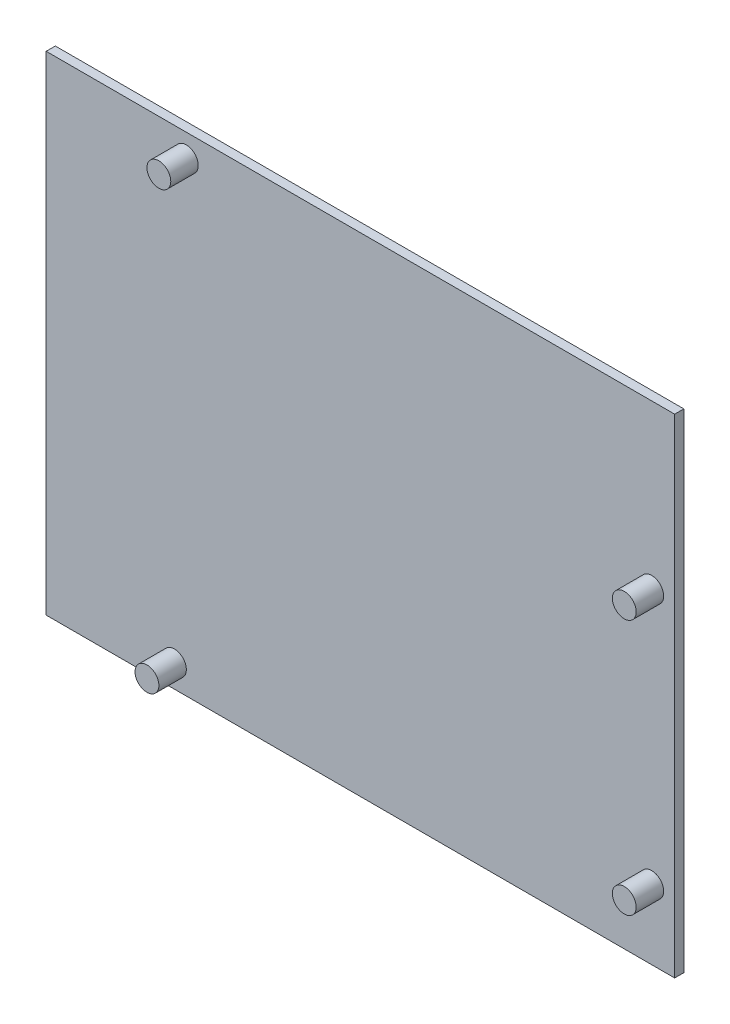
ISO-10303-21;
HEADER;
FILE_DESCRIPTION(('STEP AP214'),'2;1');
FILE_NAME('part.step','',(''),(''),'','','');
FILE_SCHEMA(('AUTOMOTIVE_DESIGN { 1 0 10303 214 1 1 1 1 }'));
ENDSEC;
DATA;
#1=APPLICATION_CONTEXT('core data for automotive mechanical design processes');
#2=APPLICATION_PROTOCOL_DEFINITION('international standard','automotive_design',2000,#1);
#3=PRODUCT_CONTEXT('',#1,'mechanical');
#4=PRODUCT('Part','Part','',(#3));
#5=PRODUCT_RELATED_PRODUCT_CATEGORY('part','',(#4));
#6=PRODUCT_DEFINITION_FORMATION('','',#4);
#7=PRODUCT_DEFINITION_CONTEXT('part definition',#1,'design');
#8=PRODUCT_DEFINITION('design','',#6,#7);
#9=PRODUCT_DEFINITION_SHAPE('','',#8);
#10=(LENGTH_UNIT() NAMED_UNIT(*) SI_UNIT(.MILLI.,.METRE.));
#11=(NAMED_UNIT(*) PLANE_ANGLE_UNIT() SI_UNIT($,.RADIAN.));
#12=(NAMED_UNIT(*) SI_UNIT($,.STERADIAN.) SOLID_ANGLE_UNIT());
#13=UNCERTAINTY_MEASURE_WITH_UNIT(LENGTH_MEASURE(1.E-05),#10,'distance_accuracy_value','');
#14=(GEOMETRIC_REPRESENTATION_CONTEXT(3) GLOBAL_UNCERTAINTY_ASSIGNED_CONTEXT((#13)) GLOBAL_UNIT_ASSIGNED_CONTEXT((#10,
#11,#12)) REPRESENTATION_CONTEXT('',''));
#15=CARTESIAN_POINT('',(0.,0.,0.));
#16=DIRECTION('',(0.,0.,1.));
#17=DIRECTION('',(1.,0.,0.));
#18=AXIS2_PLACEMENT_3D('',#15,#16,#17);
#19=CARTESIAN_POINT('',(0.,53.3,1.));
#20=DIRECTION('',(0.,0.,-1.));
#21=DIRECTION('',(-1.,0.,0.));
#22=AXIS2_PLACEMENT_3D('',#19,#20,#21);
#23=PLANE('',#22);
#24=CARTESIAN_POINT('',(15.3,50.8,1.));
#25=DIRECTION('',(0.,0.,-1.));
#26=DIRECTION('',(-1.,0.,0.));
#27=AXIS2_PLACEMENT_3D('',#24,#25,#26);
#28=CIRCLE('',#27,1.3);
#29=CARTESIAN_POINT('',(14.,50.8,1.));
#30=VERTEX_POINT('',#29);
#31=EDGE_CURVE('E42',#30,#30,#28,.F.);
#32=ORIENTED_EDGE('',*,*,#31,.F.);
#33=EDGE_LOOP('',(#32));
#34=FACE_BOUND('',#33,.T.);
#35=CARTESIAN_POINT('',(14.,2.5,1.));
#36=DIRECTION('',(0.,0.,-1.));
#37=DIRECTION('',(-1.,0.,0.));
#38=AXIS2_PLACEMENT_3D('',#35,#36,#37);
#39=CIRCLE('',#38,1.3);
#40=CARTESIAN_POINT('',(12.7,2.5,1.));
#41=VERTEX_POINT('',#40);
#42=EDGE_CURVE('E111',#41,#41,#39,.F.);
#43=ORIENTED_EDGE('',*,*,#42,.F.);
#44=EDGE_LOOP('',(#43));
#45=FACE_BOUND('',#44,.T.);
#46=DIRECTION('',(0.,-1.,0.));
#47=VECTOR('',#46,1.);
#48=CARTESIAN_POINT('',(0.,0.,1.));
#49=LINE('',#48,#47);
#50=CARTESIAN_POINT('',(0.,53.3,1.));
#51=VERTEX_POINT('',#50);
#52=CARTESIAN_POINT('',(0.,0.,1.));
#53=VERTEX_POINT('',#52);
#54=EDGE_CURVE('E86',#51,#53,#49,.T.);
#55=ORIENTED_EDGE('',*,*,#54,.T.);
#56=DIRECTION('',(1.,0.,0.));
#57=VECTOR('',#56,1.);
#58=CARTESIAN_POINT('',(0.,0.,1.));
#59=LINE('',#58,#57);
#60=CARTESIAN_POINT('',(68.6,0.,1.));
#61=VERTEX_POINT('',#60);
#62=EDGE_CURVE('E81',#53,#61,#59,.T.);
#63=ORIENTED_EDGE('',*,*,#62,.T.);
#64=DIRECTION('',(0.,1.,0.));
#65=VECTOR('',#64,1.);
#66=CARTESIAN_POINT('',(68.6,0.,1.));
#67=LINE('',#66,#65);
#68=CARTESIAN_POINT('',(68.6,53.3,1.));
#69=VERTEX_POINT('',#68);
#70=EDGE_CURVE('E84',#61,#69,#67,.T.);
#71=ORIENTED_EDGE('',*,*,#70,.T.);
#72=DIRECTION('',(-1.,0.,0.));
#73=VECTOR('',#72,1.);
#74=CARTESIAN_POINT('',(0.,53.3,1.));
#75=LINE('',#74,#73);
#76=EDGE_CURVE('E50',#69,#51,#75,.T.);
#77=ORIENTED_EDGE('',*,*,#76,.T.);
#78=EDGE_LOOP('',(#55,#63,#71,#77));
#79=FACE_BOUND('',#78,.T.);
#80=CARTESIAN_POINT('',(66.1,7.6,1.));
#81=DIRECTION('',(0.,0.,-1.));
#82=DIRECTION('',(-1.,0.,0.));
#83=AXIS2_PLACEMENT_3D('',#80,#81,#82);
#84=CIRCLE('',#83,1.29999999999999);
#85=CARTESIAN_POINT('',(64.8,7.6,1.));
#86=VERTEX_POINT('',#85);
#87=EDGE_CURVE('E114',#86,#86,#84,.F.);
#88=ORIENTED_EDGE('',*,*,#87,.F.);
#89=EDGE_LOOP('',(#88));
#90=FACE_BOUND('',#89,.T.);
#91=CARTESIAN_POINT('',(66.1,35.5,1.));
#92=DIRECTION('',(0.,0.,-1.));
#93=DIRECTION('',(-1.,0.,0.));
#94=AXIS2_PLACEMENT_3D('',#91,#92,#93);
#95=CIRCLE('',#94,1.29999999999999);
#96=CARTESIAN_POINT('',(64.8,35.5,1.));
#97=VERTEX_POINT('',#96);
#98=EDGE_CURVE('E11',#97,#97,#95,.F.);
#99=ORIENTED_EDGE('',*,*,#98,.F.);
#100=EDGE_LOOP('',(#99));
#101=FACE_BOUND('',#100,.T.);
#102=ADVANCED_FACE('F33',(#34,#45,#79,#90,#101),#23,.F.);
#103=CARTESIAN_POINT('',(0.,0.,1.));
#104=DIRECTION('',(1.,0.,0.));
#105=DIRECTION('',(0.,0.,-1.));
#106=AXIS2_PLACEMENT_3D('',#103,#104,#105);
#107=PLANE('',#106);
#108=DIRECTION('',(0.,-1.,0.));
#109=VECTOR('',#108,1.);
#110=CARTESIAN_POINT('',(0.,0.,0.));
#111=LINE('',#110,#109);
#112=CARTESIAN_POINT('',(0.,53.3,0.));
#113=VERTEX_POINT('',#112);
#114=CARTESIAN_POINT('',(0.,0.,0.));
#115=VERTEX_POINT('',#114);
#116=EDGE_CURVE('E101',#113,#115,#111,.T.);
#117=ORIENTED_EDGE('',*,*,#116,.T.);
#118=DIRECTION('',(0.,0.,-1.));
#119=VECTOR('',#118,1.);
#120=CARTESIAN_POINT('',(0.,0.,1.));
#121=LINE('',#120,#119);
#122=EDGE_CURVE('E92',#53,#115,#121,.T.);
#123=ORIENTED_EDGE('',*,*,#122,.F.);
#124=ORIENTED_EDGE('',*,*,#54,.F.);
#125=DIRECTION('',(0.,0.,-1.));
#126=VECTOR('',#125,1.);
#127=CARTESIAN_POINT('',(0.,53.3,1.));
#128=LINE('',#127,#126);
#129=EDGE_CURVE('E97',#51,#113,#128,.T.);
#130=ORIENTED_EDGE('',*,*,#129,.T.);
#131=EDGE_LOOP('',(#117,#123,#124,#130));
#132=FACE_BOUND('',#131,.T.);
#133=ADVANCED_FACE('F35',(#132),#107,.F.);
#134=CARTESIAN_POINT('',(0.,0.,1.));
#135=DIRECTION('',(0.,1.,0.));
#136=DIRECTION('',(0.,0.,1.));
#137=AXIS2_PLACEMENT_3D('',#134,#135,#136);
#138=PLANE('',#137);
#139=DIRECTION('',(1.,0.,0.));
#140=VECTOR('',#139,1.);
#141=CARTESIAN_POINT('',(0.,0.,0.));
#142=LINE('',#141,#140);
#143=CARTESIAN_POINT('',(68.6,0.,0.));
#144=VERTEX_POINT('',#143);
#145=EDGE_CURVE('E91',#115,#144,#142,.T.);
#146=ORIENTED_EDGE('',*,*,#145,.T.);
#147=DIRECTION('',(0.,0.,-1.));
#148=VECTOR('',#147,1.);
#149=CARTESIAN_POINT('',(68.6,0.,1.));
#150=LINE('',#149,#148);
#151=EDGE_CURVE('E89',#61,#144,#150,.T.);
#152=ORIENTED_EDGE('',*,*,#151,.F.);
#153=ORIENTED_EDGE('',*,*,#62,.F.);
#154=ORIENTED_EDGE('',*,*,#122,.T.);
#155=EDGE_LOOP('',(#146,#152,#153,#154));
#156=FACE_BOUND('',#155,.T.);
#157=ADVANCED_FACE('F90',(#156),#138,.F.);
#158=CARTESIAN_POINT('',(68.6,0.,1.));
#159=DIRECTION('',(-1.,0.,0.));
#160=DIRECTION('',(0.,0.,1.));
#161=AXIS2_PLACEMENT_3D('',#158,#159,#160);
#162=PLANE('',#161);
#163=DIRECTION('',(0.,1.,0.));
#164=VECTOR('',#163,1.);
#165=CARTESIAN_POINT('',(68.6,0.,0.));
#166=LINE('',#165,#164);
#167=CARTESIAN_POINT('',(68.6,53.3,0.));
#168=VERTEX_POINT('',#167);
#169=EDGE_CURVE('E67',#144,#168,#166,.T.);
#170=ORIENTED_EDGE('',*,*,#169,.T.);
#171=DIRECTION('',(0.,0.,-1.));
#172=VECTOR('',#171,1.);
#173=CARTESIAN_POINT('',(68.6,53.3,1.));
#174=LINE('',#173,#172);
#175=EDGE_CURVE('E93',#69,#168,#174,.T.);
#176=ORIENTED_EDGE('',*,*,#175,.F.);
#177=ORIENTED_EDGE('',*,*,#70,.F.);
#178=ORIENTED_EDGE('',*,*,#151,.T.);
#179=EDGE_LOOP('',(#170,#176,#177,#178));
#180=FACE_BOUND('',#179,.T.);
#181=ADVANCED_FACE('F95',(#180),#162,.F.);
#182=CARTESIAN_POINT('',(0.,53.3,1.));
#183=DIRECTION('',(0.,-1.,0.));
#184=DIRECTION('',(0.,0.,-1.));
#185=AXIS2_PLACEMENT_3D('',#182,#183,#184);
#186=PLANE('',#185);
#187=DIRECTION('',(-1.,0.,0.));
#188=VECTOR('',#187,1.);
#189=CARTESIAN_POINT('',(0.,53.3,0.));
#190=LINE('',#189,#188);
#191=EDGE_CURVE('E73',#168,#113,#190,.T.);
#192=ORIENTED_EDGE('',*,*,#191,.T.);
#193=ORIENTED_EDGE('',*,*,#129,.F.);
#194=ORIENTED_EDGE('',*,*,#76,.F.);
#195=ORIENTED_EDGE('',*,*,#175,.T.);
#196=EDGE_LOOP('',(#192,#193,#194,#195));
#197=FACE_BOUND('',#196,.T.);
#198=ADVANCED_FACE('F140',(#197),#186,.F.);
#199=CARTESIAN_POINT('',(0.,53.3,0.));
#200=DIRECTION('',(0.,0.,-1.));
#201=DIRECTION('',(-1.,0.,0.));
#202=AXIS2_PLACEMENT_3D('',#199,#200,#201);
#203=PLANE('',#202);
#204=ORIENTED_EDGE('',*,*,#116,.F.);
#205=ORIENTED_EDGE('',*,*,#191,.F.);
#206=ORIENTED_EDGE('',*,*,#169,.F.);
#207=ORIENTED_EDGE('',*,*,#145,.F.);
#208=EDGE_LOOP('',(#204,#205,#206,#207));
#209=FACE_BOUND('',#208,.T.);
#210=ADVANCED_FACE('F129',(#209),#203,.T.);
#211=CARTESIAN_POINT('',(14.,2.5,4.));
#212=DIRECTION('',(0.,0.,-1.));
#213=DIRECTION('',(-1.,0.,0.));
#214=AXIS2_PLACEMENT_3D('',#211,#212,#213);
#215=CYLINDRICAL_SURFACE('',#214,1.3);
#216=CARTESIAN_POINT('',(14.,2.5,4.));
#217=DIRECTION('',(0.,0.,1.));
#218=DIRECTION('',(1.,0.,0.));
#219=AXIS2_PLACEMENT_3D('',#216,#217,#218);
#220=CIRCLE('',#219,1.3);
#221=CARTESIAN_POINT('',(15.3,2.5,4.));
#222=VERTEX_POINT('',#221);
#223=EDGE_CURVE('E104',#222,#222,#220,.T.);
#224=ORIENTED_EDGE('',*,*,#223,.F.);
#225=EDGE_LOOP('',(#224));
#226=FACE_BOUND('',#225,.T.);
#227=ORIENTED_EDGE('',*,*,#42,.T.);
#228=EDGE_LOOP('',(#227));
#229=FACE_BOUND('',#228,.T.);
#230=ADVANCED_FACE('F126',(#226,#229),#215,.T.);
#231=CARTESIAN_POINT('',(14.,2.5,4.));
#232=DIRECTION('',(0.,0.,1.));
#233=DIRECTION('',(1.,0.,0.));
#234=AXIS2_PLACEMENT_3D('',#231,#232,#233);
#235=PLANE('',#234);
#236=ORIENTED_EDGE('',*,*,#223,.T.);
#237=EDGE_LOOP('',(#236));
#238=FACE_BOUND('',#237,.T.);
#239=ADVANCED_FACE('F128',(#238),#235,.T.);
#240=CARTESIAN_POINT('',(66.1,7.6,4.));
#241=DIRECTION('',(0.,0.,-1.));
#242=DIRECTION('',(-1.,0.,0.));
#243=AXIS2_PLACEMENT_3D('',#240,#241,#242);
#244=CYLINDRICAL_SURFACE('',#243,1.29999999999999);
#245=CARTESIAN_POINT('',(66.1,7.6,4.));
#246=DIRECTION('',(0.,0.,1.));
#247=DIRECTION('',(1.,0.,0.));
#248=AXIS2_PLACEMENT_3D('',#245,#246,#247);
#249=CIRCLE('',#248,1.29999999999999);
#250=CARTESIAN_POINT('',(67.4,7.6,4.));
#251=VERTEX_POINT('',#250);
#252=EDGE_CURVE('E160',#251,#251,#249,.T.);
#253=ORIENTED_EDGE('',*,*,#252,.F.);
#254=EDGE_LOOP('',(#253));
#255=FACE_BOUND('',#254,.T.);
#256=ORIENTED_EDGE('',*,*,#87,.T.);
#257=EDGE_LOOP('',(#256));
#258=FACE_BOUND('',#257,.T.);
#259=ADVANCED_FACE('F136',(#255,#258),#244,.T.);
#260=CARTESIAN_POINT('',(66.1,7.6,4.));
#261=DIRECTION('',(0.,0.,1.));
#262=DIRECTION('',(1.,0.,0.));
#263=AXIS2_PLACEMENT_3D('',#260,#261,#262);
#264=PLANE('',#263);
#265=ORIENTED_EDGE('',*,*,#252,.T.);
#266=EDGE_LOOP('',(#265));
#267=FACE_BOUND('',#266,.T.);
#268=ADVANCED_FACE('F189',(#267),#264,.T.);
#269=CARTESIAN_POINT('',(15.3,50.8,4.));
#270=DIRECTION('',(0.,0.,-1.));
#271=DIRECTION('',(-1.,0.,0.));
#272=AXIS2_PLACEMENT_3D('',#269,#270,#271);
#273=CYLINDRICAL_SURFACE('',#272,1.3);
#274=CARTESIAN_POINT('',(15.3,50.8,4.));
#275=DIRECTION('',(0.,0.,1.));
#276=DIRECTION('',(1.,0.,0.));
#277=AXIS2_PLACEMENT_3D('',#274,#275,#276);
#278=CIRCLE('',#277,1.3);
#279=CARTESIAN_POINT('',(16.6,50.8,4.));
#280=VERTEX_POINT('',#279);
#281=EDGE_CURVE('E163',#280,#280,#278,.T.);
#282=ORIENTED_EDGE('',*,*,#281,.F.);
#283=EDGE_LOOP('',(#282));
#284=FACE_BOUND('',#283,.T.);
#285=ORIENTED_EDGE('',*,*,#31,.T.);
#286=EDGE_LOOP('',(#285));
#287=FACE_BOUND('',#286,.T.);
#288=ADVANCED_FACE('F119',(#284,#287),#273,.T.);
#289=CARTESIAN_POINT('',(15.3,50.8,4.));
#290=DIRECTION('',(0.,0.,1.));
#291=DIRECTION('',(1.,0.,0.));
#292=AXIS2_PLACEMENT_3D('',#289,#290,#291);
#293=PLANE('',#292);
#294=ORIENTED_EDGE('',*,*,#281,.T.);
#295=EDGE_LOOP('',(#294));
#296=FACE_BOUND('',#295,.T.);
#297=ADVANCED_FACE('F175',(#296),#293,.T.);
#298=CARTESIAN_POINT('',(66.1,35.5,4.));
#299=DIRECTION('',(0.,0.,-1.));
#300=DIRECTION('',(-1.,0.,0.));
#301=AXIS2_PLACEMENT_3D('',#298,#299,#300);
#302=CYLINDRICAL_SURFACE('',#301,1.29999999999999);
#303=CARTESIAN_POINT('',(66.1,35.5,4.));
#304=DIRECTION('',(0.,0.,1.));
#305=DIRECTION('',(1.,0.,0.));
#306=AXIS2_PLACEMENT_3D('',#303,#304,#305);
#307=CIRCLE('',#306,1.29999999999999);
#308=CARTESIAN_POINT('',(67.4,35.5,4.));
#309=VERTEX_POINT('',#308);
#310=EDGE_CURVE('E166',#309,#309,#307,.T.);
#311=ORIENTED_EDGE('',*,*,#310,.F.);
#312=EDGE_LOOP('',(#311));
#313=FACE_BOUND('',#312,.T.);
#314=ORIENTED_EDGE('',*,*,#98,.T.);
#315=EDGE_LOOP('',(#314));
#316=FACE_BOUND('',#315,.T.);
#317=ADVANCED_FACE('F172',(#313,#316),#302,.T.);
#318=CARTESIAN_POINT('',(66.1,35.5,4.));
#319=DIRECTION('',(0.,0.,1.));
#320=DIRECTION('',(1.,0.,0.));
#321=AXIS2_PLACEMENT_3D('',#318,#319,#320);
#322=PLANE('',#321);
#323=ORIENTED_EDGE('',*,*,#310,.T.);
#324=EDGE_LOOP('',(#323));
#325=FACE_BOUND('',#324,.T.);
#326=ADVANCED_FACE('F170',(#325),#322,.T.);
#327=CLOSED_SHELL('',(#102,#133,#157,#181,#198,#210,#230,#239,#259,#268,#288,#297,#317,#326));
#328=MANIFOLD_SOLID_BREP('B2',#327);
#329=ADVANCED_BREP_SHAPE_REPRESENTATION('',(#18,#328),#14);
#330=SHAPE_DEFINITION_REPRESENTATION(#9,#329);
ENDSEC;
END-ISO-10303-21;
